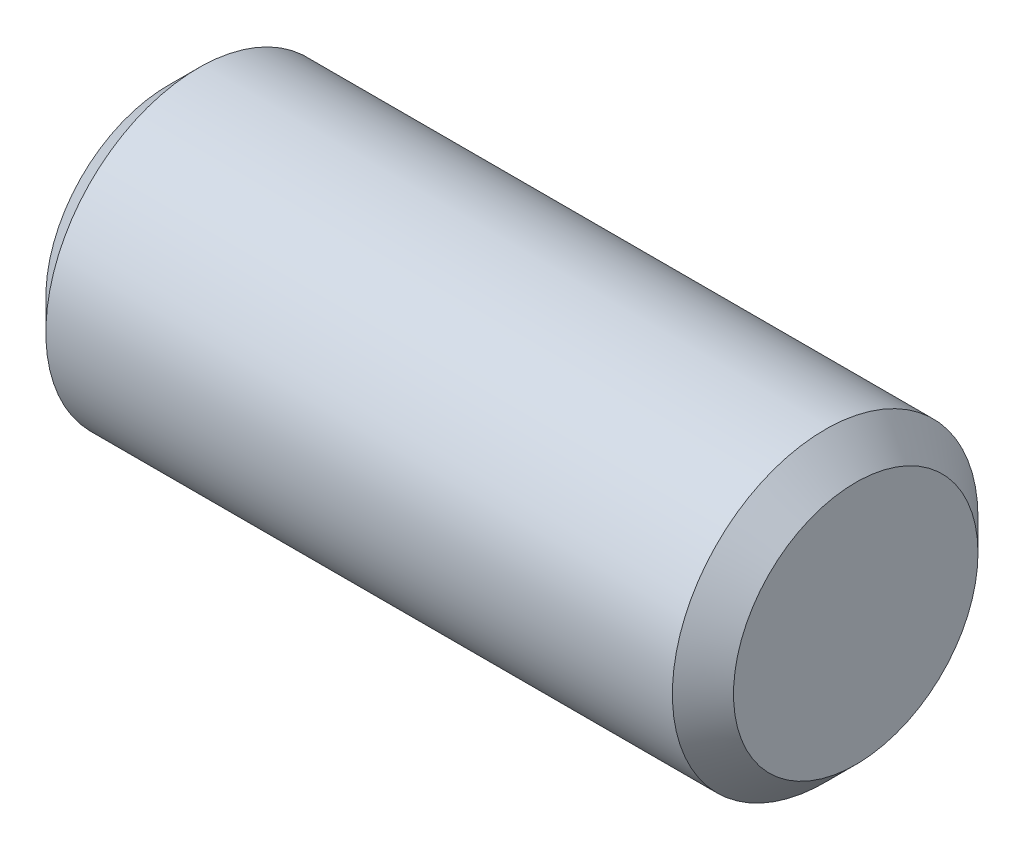
ISO-10303-21;
HEADER;
FILE_DESCRIPTION(('STEP AP214'),'2;1');
FILE_NAME('part.step','',(''),(''),'','','');
FILE_SCHEMA(('AUTOMOTIVE_DESIGN { 1 0 10303 214 1 1 1 1 }'));
ENDSEC;
DATA;
#1=APPLICATION_CONTEXT('core data for automotive mechanical design processes');
#2=APPLICATION_PROTOCOL_DEFINITION('international standard','automotive_design',2000,#1);
#3=PRODUCT_CONTEXT('',#1,'mechanical');
#4=PRODUCT('Part','Part','',(#3));
#5=PRODUCT_RELATED_PRODUCT_CATEGORY('part','',(#4));
#6=PRODUCT_DEFINITION_FORMATION('','',#4);
#7=PRODUCT_DEFINITION_CONTEXT('part definition',#1,'design');
#8=PRODUCT_DEFINITION('design','',#6,#7);
#9=PRODUCT_DEFINITION_SHAPE('','',#8);
#10=(LENGTH_UNIT() NAMED_UNIT(*) SI_UNIT(.MILLI.,.METRE.));
#11=(NAMED_UNIT(*) PLANE_ANGLE_UNIT() SI_UNIT($,.RADIAN.));
#12=(NAMED_UNIT(*) SI_UNIT($,.STERADIAN.) SOLID_ANGLE_UNIT());
#13=UNCERTAINTY_MEASURE_WITH_UNIT(LENGTH_MEASURE(1.E-05),#10,'distance_accuracy_value','');
#14=(GEOMETRIC_REPRESENTATION_CONTEXT(3) GLOBAL_UNCERTAINTY_ASSIGNED_CONTEXT((#13)) GLOBAL_UNIT_ASSIGNED_CONTEXT((#10,
#11,#12)) REPRESENTATION_CONTEXT('',''));
#15=CARTESIAN_POINT('',(0.,0.,0.));
#16=DIRECTION('',(0.,0.,1.));
#17=DIRECTION('',(1.,0.,0.));
#18=AXIS2_PLACEMENT_3D('',#15,#16,#17);
#19=CARTESIAN_POINT('',(-7.14375,0.,0.));
#20=DIRECTION('',(1.,0.,0.));
#21=DIRECTION('',(0.,0.,-1.));
#22=AXIS2_PLACEMENT_3D('',#19,#20,#21);
#23=CYLINDRICAL_SURFACE('',#22,3.175);
#24=CARTESIAN_POINT('',(6.50875,0.,0.));
#25=DIRECTION('',(1.,0.,0.));
#26=DIRECTION('',(0.,0.,-1.));
#27=AXIS2_PLACEMENT_3D('',#24,#25,#26);
#28=CIRCLE('',#27,3.175);
#29=CARTESIAN_POINT('',(6.50875,0.,-3.175));
#30=VERTEX_POINT('',#29);
#31=EDGE_CURVE('E37',#30,#30,#28,.F.);
#32=ORIENTED_EDGE('',*,*,#31,.T.);
#33=EDGE_LOOP('',(#32));
#34=FACE_BOUND('',#33,.T.);
#35=CARTESIAN_POINT('',(-6.50875,0.,0.));
#36=DIRECTION('',(1.,0.,0.));
#37=DIRECTION('',(0.,0.,-1.));
#38=AXIS2_PLACEMENT_3D('',#35,#36,#37);
#39=CIRCLE('',#38,3.175);
#40=CARTESIAN_POINT('',(-6.50875,0.,-3.175));
#41=VERTEX_POINT('',#40);
#42=EDGE_CURVE('E41',#41,#41,#39,.T.);
#43=ORIENTED_EDGE('',*,*,#42,.T.);
#44=EDGE_LOOP('',(#43));
#45=FACE_BOUND('',#44,.T.);
#46=ADVANCED_FACE('F30',(#34,#45),#23,.T.);
#47=CARTESIAN_POINT('',(-7.14375,0.,0.));
#48=DIRECTION('',(1.,0.,0.));
#49=DIRECTION('',(0.,0.,-1.));
#50=AXIS2_PLACEMENT_3D('',#47,#48,#49);
#51=PLANE('',#50);
#52=CARTESIAN_POINT('',(-7.14375,0.,0.));
#53=DIRECTION('',(1.,0.,0.));
#54=DIRECTION('',(0.,0.,-1.));
#55=AXIS2_PLACEMENT_3D('',#52,#53,#54);
#56=CIRCLE('',#55,2.54);
#57=CARTESIAN_POINT('',(-7.14375,0.,-2.54));
#58=VERTEX_POINT('',#57);
#59=EDGE_CURVE('E10',#58,#58,#56,.F.);
#60=ORIENTED_EDGE('',*,*,#59,.T.);
#61=EDGE_LOOP('',(#60));
#62=FACE_BOUND('',#61,.T.);
#63=ADVANCED_FACE('F61',(#62),#51,.F.);
#64=CARTESIAN_POINT('',(7.14375,0.,0.));
#65=DIRECTION('',(1.,0.,0.));
#66=DIRECTION('',(0.,0.,-1.));
#67=AXIS2_PLACEMENT_3D('',#64,#65,#66);
#68=PLANE('',#67);
#69=CARTESIAN_POINT('',(7.14375,0.,0.));
#70=DIRECTION('',(1.,0.,0.));
#71=DIRECTION('',(0.,0.,-1.));
#72=AXIS2_PLACEMENT_3D('',#69,#70,#71);
#73=CIRCLE('',#72,2.54);
#74=CARTESIAN_POINT('',(7.14375,0.,-2.54));
#75=VERTEX_POINT('',#74);
#76=EDGE_CURVE('E45',#75,#75,#73,.T.);
#77=ORIENTED_EDGE('',*,*,#76,.T.);
#78=EDGE_LOOP('',(#77));
#79=FACE_BOUND('',#78,.T.);
#80=ADVANCED_FACE('F51',(#79),#68,.T.);
#81=CARTESIAN_POINT('',(7.14375,0.,0.));
#82=DIRECTION('',(-1.,0.,0.));
#83=DIRECTION('',(0.,0.,1.));
#84=AXIS2_PLACEMENT_3D('',#81,#82,#83);
#85=CONICAL_SURFACE('',#84,2.54,0.785398163397448);
#86=ORIENTED_EDGE('',*,*,#31,.F.);
#87=EDGE_LOOP('',(#86));
#88=FACE_BOUND('',#87,.T.);
#89=ORIENTED_EDGE('',*,*,#76,.F.);
#90=EDGE_LOOP('',(#89));
#91=FACE_BOUND('',#90,.T.);
#92=ADVANCED_FACE('F53',(#88,#91),#85,.T.);
#93=CARTESIAN_POINT('',(-6.50875,0.,0.));
#94=DIRECTION('',(1.,0.,0.));
#95=DIRECTION('',(0.,0.,-1.));
#96=AXIS2_PLACEMENT_3D('',#93,#94,#95);
#97=CONICAL_SURFACE('',#96,3.175,0.78539816339745);
#98=ORIENTED_EDGE('',*,*,#59,.F.);
#99=EDGE_LOOP('',(#98));
#100=FACE_BOUND('',#99,.T.);
#101=ORIENTED_EDGE('',*,*,#42,.F.);
#102=EDGE_LOOP('',(#101));
#103=FACE_BOUND('',#102,.T.);
#104=ADVANCED_FACE('F32',(#100,#103),#97,.T.);
#105=CLOSED_SHELL('',(#46,#63,#80,#92,#104));
#106=MANIFOLD_SOLID_BREP('B2',#105);
#107=ADVANCED_BREP_SHAPE_REPRESENTATION('',(#18,#106),#14);
#108=SHAPE_DEFINITION_REPRESENTATION(#9,#107);
ENDSEC;
END-ISO-10303-21;
